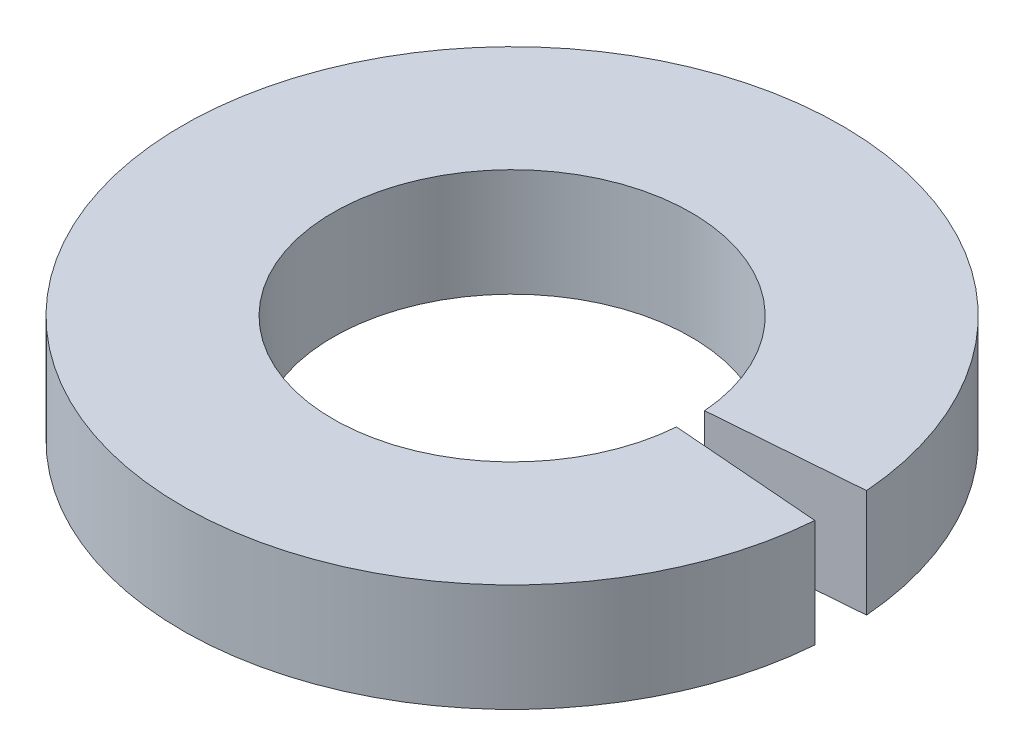
ISO-10303-21;
HEADER;
FILE_DESCRIPTION(('STEP AP214'),'2;1');
FILE_NAME('part.step','',(''),(''),'','','');
FILE_SCHEMA(('AUTOMOTIVE_DESIGN { 1 0 10303 214 1 1 1 1 }'));
ENDSEC;
DATA;
#1=APPLICATION_CONTEXT('core data for automotive mechanical design processes');
#2=APPLICATION_PROTOCOL_DEFINITION('international standard','automotive_design',2000,#1);
#3=PRODUCT_CONTEXT('',#1,'mechanical');
#4=PRODUCT('Part','Part','',(#3));
#5=PRODUCT_RELATED_PRODUCT_CATEGORY('part','',(#4));
#6=PRODUCT_DEFINITION_FORMATION('','',#4);
#7=PRODUCT_DEFINITION_CONTEXT('part definition',#1,'design');
#8=PRODUCT_DEFINITION('design','',#6,#7);
#9=PRODUCT_DEFINITION_SHAPE('','',#8);
#10=(LENGTH_UNIT() NAMED_UNIT(*) SI_UNIT(.MILLI.,.METRE.));
#11=(NAMED_UNIT(*) PLANE_ANGLE_UNIT() SI_UNIT($,.RADIAN.));
#12=(NAMED_UNIT(*) SI_UNIT($,.STERADIAN.) SOLID_ANGLE_UNIT());
#13=UNCERTAINTY_MEASURE_WITH_UNIT(LENGTH_MEASURE(1.E-05),#10,'distance_accuracy_value','');
#14=(GEOMETRIC_REPRESENTATION_CONTEXT(3) GLOBAL_UNCERTAINTY_ASSIGNED_CONTEXT((#13)) GLOBAL_UNIT_ASSIGNED_CONTEXT((#10,
#11,#12)) REPRESENTATION_CONTEXT('',''));
#15=CARTESIAN_POINT('',(0.,0.,0.));
#16=DIRECTION('',(0.,0.,1.));
#17=DIRECTION('',(1.,0.,0.));
#18=AXIS2_PLACEMENT_3D('',#15,#16,#17);
#19=CARTESIAN_POINT('',(0.,-54.2166446211728,17.4244000000001));
#20=DIRECTION('',(0.,-1.,0.));
#21=DIRECTION('',(0.,0.,-1.));
#22=AXIS2_PLACEMENT_3D('',#19,#20,#21);
#23=PLANE('',#22);
#24=DIRECTION('',(0.996917333733128,0.,0.0784590957278456));
#25=VECTOR('',#24,1.);
#26=CARTESIAN_POINT('',(0.,-54.2166446211729,13.3350000000002));
#27=LINE('',#26,#25);
#28=CARTESIAN_POINT('',(7.50788413207753,-54.2166446211729,13.9258832958361));
#29=VERTEX_POINT('',#28);
#30=CARTESIAN_POINT('',(4.07679374456822,-54.2166446211729,13.6558506260696));
#31=VERTEX_POINT('',#30);
#32=EDGE_CURVE('E73',#29,#31,#27,.F.);
#33=ORIENTED_EDGE('',*,*,#32,.T.);
#34=CARTESIAN_POINT('',(0.,-54.2166446211728,13.3350000000001));
#35=DIRECTION('',(0.,-1.,0.));
#36=DIRECTION('',(0.,0.,-1.));
#37=AXIS2_PLACEMENT_3D('',#34,#35,#36);
#38=CIRCLE('',#37,4.08940000000001);
#39=CARTESIAN_POINT('',(4.07679374456823,-54.2166446211729,13.0141493739307));
#40=VERTEX_POINT('',#39);
#41=EDGE_CURVE('E64',#31,#40,#38,.T.);
#42=ORIENTED_EDGE('',*,*,#41,.T.);
#43=DIRECTION('',(0.996917333733128,0.,-0.0784590957278459));
#44=VECTOR('',#43,1.);
#45=CARTESIAN_POINT('',(0.,-54.2166446211729,13.3350000000002));
#46=LINE('',#45,#44);
#47=CARTESIAN_POINT('',(7.50788413207754,-54.2166446211729,12.7441167041642));
#48=VERTEX_POINT('',#47);
#49=EDGE_CURVE('E62',#48,#40,#46,.F.);
#50=ORIENTED_EDGE('',*,*,#49,.F.);
#51=CARTESIAN_POINT('',(0.,-54.2166446211729,13.3350000000001));
#52=DIRECTION('',(0.,-1.,0.));
#53=DIRECTION('',(0.,0.,-1.));
#54=AXIS2_PLACEMENT_3D('',#51,#52,#53);
#55=CIRCLE('',#54,7.53110000000002);
#56=EDGE_CURVE('E18',#29,#48,#55,.T.);
#57=ORIENTED_EDGE('',*,*,#56,.F.);
#58=EDGE_LOOP('',(#33,#42,#50,#57));
#59=FACE_BOUND('',#58,.T.);
#60=ADVANCED_FACE('F15',(#59),#23,.F.);
#61=CARTESIAN_POINT('',(0.,-56.6804446211729,13.3350000000001));
#62=DIRECTION('',(0.0784590957278459,0.,0.996917333733128));
#63=DIRECTION('',(0.996917333733128,0.,-0.0784590957278459));
#64=AXIS2_PLACEMENT_3D('',#61,#62,#63);
#65=PLANE('',#64);
#66=DIRECTION('',(0.,-1.,0.));
#67=VECTOR('',#66,1.);
#68=CARTESIAN_POINT('',(7.50788413207754,-89.1416446211728,12.7441167041641));
#69=LINE('',#68,#67);
#70=CARTESIAN_POINT('',(7.50788413207754,-56.6804446211729,12.7441167041641));
#71=VERTEX_POINT('',#70);
#72=EDGE_CURVE('E59',#48,#71,#69,.T.);
#73=ORIENTED_EDGE('',*,*,#72,.F.);
#74=ORIENTED_EDGE('',*,*,#49,.T.);
#75=DIRECTION('',(0.,-1.,0.));
#76=VECTOR('',#75,1.);
#77=CARTESIAN_POINT('',(4.07679374456823,-89.1416446211728,13.0141493739306));
#78=LINE('',#77,#76);
#79=CARTESIAN_POINT('',(4.07679374456823,-56.6804446211729,13.0141493739306));
#80=VERTEX_POINT('',#79);
#81=EDGE_CURVE('E77',#40,#80,#78,.T.);
#82=ORIENTED_EDGE('',*,*,#81,.T.);
#83=DIRECTION('',(0.996917333733129,0.,-0.0784590957278342));
#84=VECTOR('',#83,1.);
#85=CARTESIAN_POINT('',(4.07679374456822,-56.6804446211729,13.0141493739306));
#86=LINE('',#85,#84);
#87=EDGE_CURVE('E71',#80,#71,#86,.T.);
#88=ORIENTED_EDGE('',*,*,#87,.T.);
#89=EDGE_LOOP('',(#73,#74,#82,#88));
#90=FACE_BOUND('',#89,.T.);
#91=ADVANCED_FACE('F70',(#90),#65,.T.);
#92=CARTESIAN_POINT('',(0.,-89.1416446211728,13.3350000000001));
#93=DIRECTION('',(0.,-1.,0.));
#94=DIRECTION('',(0.,0.,-1.));
#95=AXIS2_PLACEMENT_3D('',#92,#93,#94);
#96=CYLINDRICAL_SURFACE('',#95,7.53110000000002);
#97=ORIENTED_EDGE('',*,*,#56,.T.);
#98=ORIENTED_EDGE('',*,*,#72,.T.);
#99=CARTESIAN_POINT('',(0.,-56.6804446211729,13.3350000000001));
#100=DIRECTION('',(0.,-1.,0.));
#101=DIRECTION('',(0.,0.,-1.));
#102=AXIS2_PLACEMENT_3D('',#99,#100,#101);
#103=CIRCLE('',#102,7.53110000000002);
#104=CARTESIAN_POINT('',(7.50788413207753,-56.6804446211729,13.9258832958361));
#105=VERTEX_POINT('',#104);
#106=EDGE_CURVE('E79',#71,#105,#103,.F.);
#107=ORIENTED_EDGE('',*,*,#106,.T.);
#108=DIRECTION('',(0.,1.,0.));
#109=VECTOR('',#108,1.);
#110=CARTESIAN_POINT('',(7.50788413207752,-56.6804446211729,13.9258832958361));
#111=LINE('',#110,#109);
#112=EDGE_CURVE('E61',#105,#29,#111,.T.);
#113=ORIENTED_EDGE('',*,*,#112,.T.);
#114=EDGE_LOOP('',(#97,#98,#107,#113));
#115=FACE_BOUND('',#114,.T.);
#116=ADVANCED_FACE('F56',(#115),#96,.T.);
#117=CARTESIAN_POINT('',(0.,-56.6804446211729,13.3350000000001));
#118=DIRECTION('',(-0.0784590957278456,0.,0.996917333733128));
#119=DIRECTION('',(0.996917333733128,0.,0.0784590957278456));
#120=AXIS2_PLACEMENT_3D('',#117,#118,#119);
#121=PLANE('',#120);
#122=ORIENTED_EDGE('',*,*,#112,.F.);
#123=DIRECTION('',(-0.996917333733128,0.,-0.0784590957278464));
#124=VECTOR('',#123,1.);
#125=CARTESIAN_POINT('',(7.50788413207753,-56.6804446211729,13.9258832958361));
#126=LINE('',#125,#124);
#127=CARTESIAN_POINT('',(4.07679374456823,-56.6804446211728,13.6558506260696));
#128=VERTEX_POINT('',#127);
#129=EDGE_CURVE('E24',#105,#128,#126,.T.);
#130=ORIENTED_EDGE('',*,*,#129,.T.);
#131=DIRECTION('',(0.,-1.,0.));
#132=VECTOR('',#131,1.);
#133=CARTESIAN_POINT('',(4.07679374456823,-89.1416446211728,13.6558506260695));
#134=LINE('',#133,#132);
#135=EDGE_CURVE('E32',#128,#31,#134,.F.);
#136=ORIENTED_EDGE('',*,*,#135,.T.);
#137=ORIENTED_EDGE('',*,*,#32,.F.);
#138=EDGE_LOOP('',(#122,#130,#136,#137));
#139=FACE_BOUND('',#138,.T.);
#140=ADVANCED_FACE('F86',(#139),#121,.F.);
#141=CARTESIAN_POINT('',(0.,-89.1416446211728,13.3350000000001));
#142=DIRECTION('',(0.,-1.,0.));
#143=DIRECTION('',(0.,0.,-1.));
#144=AXIS2_PLACEMENT_3D('',#141,#142,#143);
#145=CYLINDRICAL_SURFACE('',#144,4.08940000000001);
#146=ORIENTED_EDGE('',*,*,#135,.F.);
#147=CARTESIAN_POINT('',(0.,-56.6804446211729,13.3350000000001));
#148=DIRECTION('',(0.,-1.,0.));
#149=DIRECTION('',(0.,0.,-1.));
#150=AXIS2_PLACEMENT_3D('',#147,#148,#149);
#151=CIRCLE('',#150,4.08940000000001);
#152=EDGE_CURVE('E10',#128,#80,#151,.T.);
#153=ORIENTED_EDGE('',*,*,#152,.T.);
#154=ORIENTED_EDGE('',*,*,#81,.F.);
#155=ORIENTED_EDGE('',*,*,#41,.F.);
#156=EDGE_LOOP('',(#146,#153,#154,#155));
#157=FACE_BOUND('',#156,.T.);
#158=ADVANCED_FACE('F89',(#157),#145,.F.);
#159=CARTESIAN_POINT('',(0.,-56.6804446211729,20.8661000000001));
#160=DIRECTION('',(0.,1.,0.));
#161=DIRECTION('',(0.,0.,1.));
#162=AXIS2_PLACEMENT_3D('',#159,#160,#161);
#163=PLANE('',#162);
#164=ORIENTED_EDGE('',*,*,#129,.F.);
#165=ORIENTED_EDGE('',*,*,#106,.F.);
#166=ORIENTED_EDGE('',*,*,#87,.F.);
#167=ORIENTED_EDGE('',*,*,#152,.F.);
#168=EDGE_LOOP('',(#164,#165,#166,#167));
#169=FACE_BOUND('',#168,.T.);
#170=ADVANCED_FACE('F88',(#169),#163,.F.);
#171=CLOSED_SHELL('',(#60,#91,#116,#140,#158,#170));
#172=MANIFOLD_SOLID_BREP('B1',#171);
#173=ADVANCED_BREP_SHAPE_REPRESENTATION('',(#18,#172),#14);
#174=SHAPE_DEFINITION_REPRESENTATION(#9,#173);
ENDSEC;
END-ISO-10303-21;
